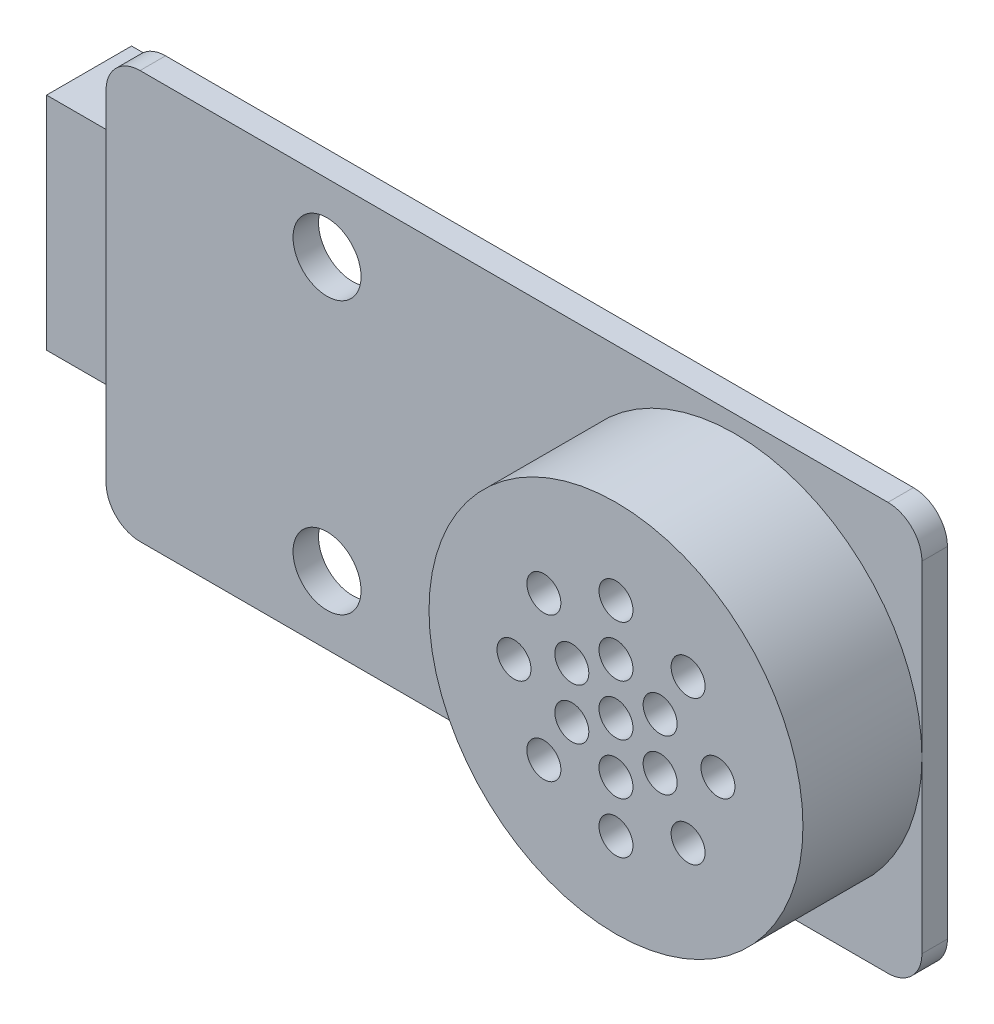
ISO-10303-21;
HEADER;
FILE_DESCRIPTION(('STEP AP214'),'2;1');
FILE_NAME('part.step','',(''),(''),'','','');
FILE_SCHEMA(('AUTOMOTIVE_DESIGN { 1 0 10303 214 1 1 1 1 }'));
ENDSEC;
DATA;
#1=APPLICATION_CONTEXT('core data for automotive mechanical design processes');
#2=APPLICATION_PROTOCOL_DEFINITION('international standard','automotive_design',2000,#1);
#3=PRODUCT_CONTEXT('',#1,'mechanical');
#4=PRODUCT('Part','Part','',(#3));
#5=PRODUCT_RELATED_PRODUCT_CATEGORY('part','',(#4));
#6=PRODUCT_DEFINITION_FORMATION('','',#4);
#7=PRODUCT_DEFINITION_CONTEXT('part definition',#1,'design');
#8=PRODUCT_DEFINITION('design','',#6,#7);
#9=PRODUCT_DEFINITION_SHAPE('','',#8);
#10=(LENGTH_UNIT() NAMED_UNIT(*) SI_UNIT(.MILLI.,.METRE.));
#11=(NAMED_UNIT(*) PLANE_ANGLE_UNIT() SI_UNIT($,.RADIAN.));
#12=(NAMED_UNIT(*) SI_UNIT($,.STERADIAN.) SOLID_ANGLE_UNIT());
#13=UNCERTAINTY_MEASURE_WITH_UNIT(LENGTH_MEASURE(1.E-05),#10,'distance_accuracy_value','');
#14=(GEOMETRIC_REPRESENTATION_CONTEXT(3) GLOBAL_UNCERTAINTY_ASSIGNED_CONTEXT((#13)) GLOBAL_UNIT_ASSIGNED_CONTEXT((#10,
#11,#12)) REPRESENTATION_CONTEXT('',''));
#15=CARTESIAN_POINT('',(0.,0.,0.));
#16=DIRECTION('',(0.,0.,1.));
#17=DIRECTION('',(1.,0.,0.));
#18=AXIS2_PLACEMENT_3D('',#15,#16,#17);
#19=CARTESIAN_POINT('',(24.,-12.,1.5));
#20=DIRECTION('',(-1.,0.,0.));
#21=DIRECTION('',(0.,0.,1.));
#22=AXIS2_PLACEMENT_3D('',#19,#20,#21);
#23=PLANE('',#22);
#24=DIRECTION('',(0.,1.,0.));
#25=VECTOR('',#24,1.);
#26=CARTESIAN_POINT('',(24.,-12.,1.5));
#27=LINE('',#26,#25);
#28=CARTESIAN_POINT('',(24.,-10.,1.5));
#29=VERTEX_POINT('',#28);
#30=CARTESIAN_POINT('',(24.,0.,1.5));
#31=VERTEX_POINT('',#30);
#32=EDGE_CURVE('E179',#29,#31,#27,.T.);
#33=ORIENTED_EDGE('',*,*,#32,.F.);
#34=DIRECTION('',(0.,0.,-1.));
#35=VECTOR('',#34,1.);
#36=CARTESIAN_POINT('',(24.,-10.,1.5));
#37=LINE('',#36,#35);
#38=CARTESIAN_POINT('',(24.,-10.,0.));
#39=VERTEX_POINT('',#38);
#40=EDGE_CURVE('E232',#29,#39,#37,.T.);
#41=ORIENTED_EDGE('',*,*,#40,.T.);
#42=DIRECTION('',(0.,1.,0.));
#43=VECTOR('',#42,1.);
#44=CARTESIAN_POINT('',(24.,-12.,0.));
#45=LINE('',#44,#43);
#46=CARTESIAN_POINT('',(24.,10.,0.));
#47=VERTEX_POINT('',#46);
#48=EDGE_CURVE('E177',#39,#47,#45,.T.);
#49=ORIENTED_EDGE('',*,*,#48,.T.);
#50=DIRECTION('',(0.,0.,-1.));
#51=VECTOR('',#50,1.);
#52=CARTESIAN_POINT('',(24.,10.,1.5));
#53=LINE('',#52,#51);
#54=CARTESIAN_POINT('',(24.,10.,1.5));
#55=VERTEX_POINT('',#54);
#56=EDGE_CURVE('E229',#47,#55,#53,.F.);
#57=ORIENTED_EDGE('',*,*,#56,.T.);
#58=EDGE_CURVE('E182',#31,#55,#27,.T.);
#59=ORIENTED_EDGE('',*,*,#58,.F.);
#60=EDGE_LOOP('',(#33,#41,#49,#57,#59));
#61=FACE_BOUND('',#60,.T.);
#62=ADVANCED_FACE('F42',(#61),#23,.F.);
#63=CARTESIAN_POINT('',(-24.,12.,1.5));
#64=DIRECTION('',(0.,-1.,0.));
#65=DIRECTION('',(0.,0.,-1.));
#66=AXIS2_PLACEMENT_3D('',#63,#64,#65);
#67=PLANE('',#66);
#68=DIRECTION('',(-1.,0.,0.));
#69=VECTOR('',#68,1.);
#70=CARTESIAN_POINT('',(-24.,12.,1.5));
#71=LINE('',#70,#69);
#72=CARTESIAN_POINT('',(22.,12.,1.5));
#73=VERTEX_POINT('',#72);
#74=CARTESIAN_POINT('',(-22.,12.,1.5));
#75=VERTEX_POINT('',#74);
#76=EDGE_CURVE('E181',#73,#75,#71,.T.);
#77=ORIENTED_EDGE('',*,*,#76,.F.);
#78=DIRECTION('',(0.,0.,-1.));
#79=VECTOR('',#78,1.);
#80=CARTESIAN_POINT('',(22.,12.,1.5));
#81=LINE('',#80,#79);
#82=CARTESIAN_POINT('',(22.,12.,0.));
#83=VERTEX_POINT('',#82);
#84=EDGE_CURVE('E51',#73,#83,#81,.T.);
#85=ORIENTED_EDGE('',*,*,#84,.T.);
#86=DIRECTION('',(-1.,0.,0.));
#87=VECTOR('',#86,1.);
#88=CARTESIAN_POINT('',(-24.,12.,0.));
#89=LINE('',#88,#87);
#90=CARTESIAN_POINT('',(-22.,12.,0.));
#91=VERTEX_POINT('',#90);
#92=EDGE_CURVE('E194',#83,#91,#89,.T.);
#93=ORIENTED_EDGE('',*,*,#92,.T.);
#94=DIRECTION('',(0.,0.,-1.));
#95=VECTOR('',#94,1.);
#96=CARTESIAN_POINT('',(-22.,12.,1.5));
#97=LINE('',#96,#95);
#98=EDGE_CURVE('E235',#91,#75,#97,.F.);
#99=ORIENTED_EDGE('',*,*,#98,.T.);
#100=EDGE_LOOP('',(#77,#85,#93,#99));
#101=FACE_BOUND('',#100,.T.);
#102=ADVANCED_FACE('F318',(#101),#67,.F.);
#103=CARTESIAN_POINT('',(-24.,-12.,1.5));
#104=DIRECTION('',(1.,0.,0.));
#105=DIRECTION('',(0.,0.,-1.));
#106=AXIS2_PLACEMENT_3D('',#103,#104,#105);
#107=PLANE('',#106);
#108=DIRECTION('',(0.,-1.,0.));
#109=VECTOR('',#108,1.);
#110=CARTESIAN_POINT('',(-24.,-12.,0.));
#111=LINE('',#110,#109);
#112=CARTESIAN_POINT('',(-24.,10.,0.));
#113=VERTEX_POINT('',#112);
#114=CARTESIAN_POINT('',(-24.,6.5,0.));
#115=VERTEX_POINT('',#114);
#116=EDGE_CURVE('E197',#113,#115,#111,.T.);
#117=ORIENTED_EDGE('',*,*,#116,.T.);
#118=CARTESIAN_POINT('',(-24.,-6.5,0.));
#119=VERTEX_POINT('',#118);
#120=EDGE_CURVE('E201',#115,#119,#111,.T.);
#121=ORIENTED_EDGE('',*,*,#120,.T.);
#122=CARTESIAN_POINT('',(-24.,-10.,0.));
#123=VERTEX_POINT('',#122);
#124=EDGE_CURVE('E65',#119,#123,#111,.T.);
#125=ORIENTED_EDGE('',*,*,#124,.T.);
#126=DIRECTION('',(0.,0.,-1.));
#127=VECTOR('',#126,1.);
#128=CARTESIAN_POINT('',(-24.,-10.,1.5));
#129=LINE('',#128,#127);
#130=CARTESIAN_POINT('',(-24.,-10.,1.5));
#131=VERTEX_POINT('',#130);
#132=EDGE_CURVE('E219',#123,#131,#129,.F.);
#133=ORIENTED_EDGE('',*,*,#132,.T.);
#134=DIRECTION('',(0.,-1.,0.));
#135=VECTOR('',#134,1.);
#136=CARTESIAN_POINT('',(-24.,-12.,1.5));
#137=LINE('',#136,#135);
#138=CARTESIAN_POINT('',(-24.,10.,1.5));
#139=VERTEX_POINT('',#138);
#140=EDGE_CURVE('E185',#139,#131,#137,.T.);
#141=ORIENTED_EDGE('',*,*,#140,.F.);
#142=DIRECTION('',(0.,0.,-1.));
#143=VECTOR('',#142,1.);
#144=CARTESIAN_POINT('',(-24.,10.,1.5));
#145=LINE('',#144,#143);
#146=EDGE_CURVE('E216',#139,#113,#145,.T.);
#147=ORIENTED_EDGE('',*,*,#146,.T.);
#148=EDGE_LOOP('',(#117,#121,#125,#133,#141,#147));
#149=FACE_BOUND('',#148,.T.);
#150=ADVANCED_FACE('F276',(#149),#107,.F.);
#151=CARTESIAN_POINT('',(-24.,-12.,1.5));
#152=DIRECTION('',(0.,1.,0.));
#153=DIRECTION('',(0.,0.,1.));
#154=AXIS2_PLACEMENT_3D('',#151,#152,#153);
#155=PLANE('',#154);
#156=DIRECTION('',(1.,0.,0.));
#157=VECTOR('',#156,1.);
#158=CARTESIAN_POINT('',(-24.,-12.,1.5));
#159=LINE('',#158,#157);
#160=CARTESIAN_POINT('',(-22.,-12.,1.5));
#161=VERTEX_POINT('',#160);
#162=CARTESIAN_POINT('',(22.,-12.,1.5));
#163=VERTEX_POINT('',#162);
#164=EDGE_CURVE('E188',#161,#163,#159,.T.);
#165=ORIENTED_EDGE('',*,*,#164,.F.);
#166=DIRECTION('',(0.,0.,-1.));
#167=VECTOR('',#166,1.);
#168=CARTESIAN_POINT('',(-22.,-12.,1.5));
#169=LINE('',#168,#167);
#170=CARTESIAN_POINT('',(-22.,-12.,0.));
#171=VERTEX_POINT('',#170);
#172=EDGE_CURVE('E205',#161,#171,#169,.T.);
#173=ORIENTED_EDGE('',*,*,#172,.T.);
#174=DIRECTION('',(1.,0.,0.));
#175=VECTOR('',#174,1.);
#176=CARTESIAN_POINT('',(-24.,-12.,0.));
#177=LINE('',#176,#175);
#178=CARTESIAN_POINT('',(22.,-12.,0.));
#179=VERTEX_POINT('',#178);
#180=EDGE_CURVE('E200',#171,#179,#177,.T.);
#181=ORIENTED_EDGE('',*,*,#180,.T.);
#182=DIRECTION('',(0.,0.,-1.));
#183=VECTOR('',#182,1.);
#184=CARTESIAN_POINT('',(22.,-12.,1.5));
#185=LINE('',#184,#183);
#186=EDGE_CURVE('E191',#179,#163,#185,.F.);
#187=ORIENTED_EDGE('',*,*,#186,.T.);
#188=EDGE_LOOP('',(#165,#173,#181,#187));
#189=FACE_BOUND('',#188,.T.);
#190=ADVANCED_FACE('F289',(#189),#155,.F.);
#191=CARTESIAN_POINT('',(0.,0.,1.5));
#192=DIRECTION('',(0.,0.,-1.));
#193=DIRECTION('',(-1.,0.,0.));
#194=AXIS2_PLACEMENT_3D('',#191,#192,#193);
#195=PLANE('',#194);
#196=CARTESIAN_POINT('',(-11.,8.,1.5));
#197=DIRECTION('',(0.,0.,1.));
#198=DIRECTION('',(1.,0.,0.));
#199=AXIS2_PLACEMENT_3D('',#196,#197,#198);
#200=CIRCLE('',#199,2.);
#201=CARTESIAN_POINT('',(-9.,8.,1.5));
#202=VERTEX_POINT('',#201);
#203=EDGE_CURVE('E240',#202,#202,#200,.T.);
#204=ORIENTED_EDGE('',*,*,#203,.F.);
#205=EDGE_LOOP('',(#204));
#206=FACE_BOUND('',#205,.T.);
#207=CARTESIAN_POINT('',(-11.,-8.,1.5));
#208=DIRECTION('',(0.,0.,1.));
#209=DIRECTION('',(-1.,0.,0.));
#210=AXIS2_PLACEMENT_3D('',#207,#208,#209);
#211=CIRCLE('',#210,2.);
#212=CARTESIAN_POINT('',(-13.,-8.,1.5));
#213=VERTEX_POINT('',#212);
#214=EDGE_CURVE('E245',#213,#213,#211,.T.);
#215=ORIENTED_EDGE('',*,*,#214,.F.);
#216=EDGE_LOOP('',(#215));
#217=FACE_BOUND('',#216,.T.);
#218=ORIENTED_EDGE('',*,*,#32,.T.);
#219=CARTESIAN_POINT('',(13.,0.,1.5));
#220=DIRECTION('',(0.,0.,1.));
#221=DIRECTION('',(1.,0.,0.));
#222=AXIS2_PLACEMENT_3D('',#219,#220,#221);
#223=CIRCLE('',#222,11.);
#224=EDGE_CURVE('E167',#31,#31,#223,.T.);
#225=ORIENTED_EDGE('',*,*,#224,.F.);
#226=ORIENTED_EDGE('',*,*,#58,.T.);
#227=CARTESIAN_POINT('',(22.,10.,1.5));
#228=DIRECTION('',(0.,0.,-1.));
#229=DIRECTION('',(-1.,0.,0.));
#230=AXIS2_PLACEMENT_3D('',#227,#228,#229);
#231=CIRCLE('',#230,2.);
#232=EDGE_CURVE('E223',#55,#73,#231,.F.);
#233=ORIENTED_EDGE('',*,*,#232,.T.);
#234=ORIENTED_EDGE('',*,*,#76,.T.);
#235=CARTESIAN_POINT('',(-22.,10.,1.5));
#236=DIRECTION('',(0.,0.,-1.));
#237=DIRECTION('',(-1.,0.,0.));
#238=AXIS2_PLACEMENT_3D('',#235,#236,#237);
#239=CIRCLE('',#238,2.);
#240=EDGE_CURVE('E221',#75,#139,#239,.F.);
#241=ORIENTED_EDGE('',*,*,#240,.T.);
#242=ORIENTED_EDGE('',*,*,#140,.T.);
#243=CARTESIAN_POINT('',(-22.,-10.,1.5));
#244=DIRECTION('',(0.,0.,-1.));
#245=DIRECTION('',(-1.,0.,0.));
#246=AXIS2_PLACEMENT_3D('',#243,#244,#245);
#247=CIRCLE('',#246,2.);
#248=EDGE_CURVE('E227',#131,#161,#247,.F.);
#249=ORIENTED_EDGE('',*,*,#248,.T.);
#250=ORIENTED_EDGE('',*,*,#164,.T.);
#251=CARTESIAN_POINT('',(22.,-10.,1.5));
#252=DIRECTION('',(0.,0.,-1.));
#253=DIRECTION('',(-1.,0.,0.));
#254=AXIS2_PLACEMENT_3D('',#251,#252,#253);
#255=CIRCLE('',#254,2.);
#256=EDGE_CURVE('E225',#163,#29,#255,.F.);
#257=ORIENTED_EDGE('',*,*,#256,.T.);
#258=EDGE_LOOP('',(#218,#225,#226,#233,#234,#241,#242,#249,#250,#257));
#259=FACE_BOUND('',#258,.T.);
#260=ADVANCED_FACE('F286',(#206,#217,#259),#195,.F.);
#261=CARTESIAN_POINT('',(0.,0.,0.));
#262=DIRECTION('',(0.,0.,-1.));
#263=DIRECTION('',(-1.,0.,0.));
#264=AXIS2_PLACEMENT_3D('',#261,#262,#263);
#265=PLANE('',#264);
#266=CARTESIAN_POINT('',(-11.,8.,0.));
#267=DIRECTION('',(0.,0.,-1.));
#268=DIRECTION('',(-1.,0.,0.));
#269=AXIS2_PLACEMENT_3D('',#266,#267,#268);
#270=CIRCLE('',#269,2.);
#271=CARTESIAN_POINT('',(-13.,8.,0.));
#272=VERTEX_POINT('',#271);
#273=EDGE_CURVE('E46',#272,#272,#270,.T.);
#274=ORIENTED_EDGE('',*,*,#273,.F.);
#275=EDGE_LOOP('',(#274));
#276=FACE_BOUND('',#275,.T.);
#277=CARTESIAN_POINT('',(-11.,-8.,0.));
#278=DIRECTION('',(0.,0.,-1.));
#279=DIRECTION('',(-1.,0.,0.));
#280=AXIS2_PLACEMENT_3D('',#277,#278,#279);
#281=CIRCLE('',#280,2.);
#282=CARTESIAN_POINT('',(-13.,-8.,0.));
#283=VERTEX_POINT('',#282);
#284=EDGE_CURVE('E238',#283,#283,#281,.T.);
#285=ORIENTED_EDGE('',*,*,#284,.F.);
#286=EDGE_LOOP('',(#285));
#287=FACE_BOUND('',#286,.T.);
#288=DIRECTION('',(-1.,0.,0.));
#289=VECTOR('',#288,1.);
#290=CARTESIAN_POINT('',(-18.,-6.5,0.));
#291=LINE('',#290,#289);
#292=CARTESIAN_POINT('',(-18.,-6.5,0.));
#293=VERTEX_POINT('',#292);
#294=EDGE_CURVE('E60',#293,#119,#291,.T.);
#295=ORIENTED_EDGE('',*,*,#294,.F.);
#296=DIRECTION('',(0.,-1.,0.));
#297=VECTOR('',#296,1.);
#298=CARTESIAN_POINT('',(-18.,-6.5,0.));
#299=LINE('',#298,#297);
#300=CARTESIAN_POINT('',(-18.,6.5,0.));
#301=VERTEX_POINT('',#300);
#302=EDGE_CURVE('E259',#301,#293,#299,.T.);
#303=ORIENTED_EDGE('',*,*,#302,.F.);
#304=DIRECTION('',(1.,0.,0.));
#305=VECTOR('',#304,1.);
#306=CARTESIAN_POINT('',(-18.,6.5,0.));
#307=LINE('',#306,#305);
#308=EDGE_CURVE('E11',#115,#301,#307,.T.);
#309=ORIENTED_EDGE('',*,*,#308,.F.);
#310=ORIENTED_EDGE('',*,*,#116,.F.);
#311=CARTESIAN_POINT('',(-22.,10.,0.));
#312=DIRECTION('',(0.,0.,-1.));
#313=DIRECTION('',(-1.,0.,0.));
#314=AXIS2_PLACEMENT_3D('',#311,#312,#313);
#315=CIRCLE('',#314,2.);
#316=EDGE_CURVE('E208',#113,#91,#315,.T.);
#317=ORIENTED_EDGE('',*,*,#316,.T.);
#318=ORIENTED_EDGE('',*,*,#92,.F.);
#319=CARTESIAN_POINT('',(22.,10.,0.));
#320=DIRECTION('',(0.,0.,-1.));
#321=DIRECTION('',(-1.,0.,0.));
#322=AXIS2_PLACEMENT_3D('',#319,#320,#321);
#323=CIRCLE('',#322,2.);
#324=EDGE_CURVE('E210',#83,#47,#323,.T.);
#325=ORIENTED_EDGE('',*,*,#324,.T.);
#326=ORIENTED_EDGE('',*,*,#48,.F.);
#327=CARTESIAN_POINT('',(22.,-10.,0.));
#328=DIRECTION('',(0.,0.,-1.));
#329=DIRECTION('',(-1.,0.,0.));
#330=AXIS2_PLACEMENT_3D('',#327,#328,#329);
#331=CIRCLE('',#330,2.);
#332=EDGE_CURVE('E212',#39,#179,#331,.T.);
#333=ORIENTED_EDGE('',*,*,#332,.T.);
#334=ORIENTED_EDGE('',*,*,#180,.F.);
#335=CARTESIAN_POINT('',(-22.,-10.,0.));
#336=DIRECTION('',(0.,0.,-1.));
#337=DIRECTION('',(-1.,0.,0.));
#338=AXIS2_PLACEMENT_3D('',#335,#336,#337);
#339=CIRCLE('',#338,2.);
#340=EDGE_CURVE('E214',#171,#123,#339,.T.);
#341=ORIENTED_EDGE('',*,*,#340,.T.);
#342=ORIENTED_EDGE('',*,*,#124,.F.);
#343=EDGE_LOOP('',(#295,#303,#309,#310,#317,#318,#325,#326,#333,#334,#341,#342));
#344=FACE_BOUND('',#343,.T.);
#345=ADVANCED_FACE('F269',(#276,#287,#344),#265,.T.);
#346=CARTESIAN_POINT('',(-22.,-10.,1.5));
#347=DIRECTION('',(0.,0.,-1.));
#348=DIRECTION('',(-1.,0.,0.));
#349=AXIS2_PLACEMENT_3D('',#346,#347,#348);
#350=CYLINDRICAL_SURFACE('',#349,2.);
#351=ORIENTED_EDGE('',*,*,#248,.F.);
#352=ORIENTED_EDGE('',*,*,#132,.F.);
#353=ORIENTED_EDGE('',*,*,#340,.F.);
#354=ORIENTED_EDGE('',*,*,#172,.F.);
#355=EDGE_LOOP('',(#351,#352,#353,#354));
#356=FACE_BOUND('',#355,.T.);
#357=ADVANCED_FACE('F283',(#356),#350,.T.);
#358=CARTESIAN_POINT('',(22.,-10.,1.5));
#359=DIRECTION('',(0.,0.,-1.));
#360=DIRECTION('',(-1.,0.,0.));
#361=AXIS2_PLACEMENT_3D('',#358,#359,#360);
#362=CYLINDRICAL_SURFACE('',#361,2.);
#363=ORIENTED_EDGE('',*,*,#256,.F.);
#364=ORIENTED_EDGE('',*,*,#186,.F.);
#365=ORIENTED_EDGE('',*,*,#332,.F.);
#366=ORIENTED_EDGE('',*,*,#40,.F.);
#367=EDGE_LOOP('',(#363,#364,#365,#366));
#368=FACE_BOUND('',#367,.T.);
#369=ADVANCED_FACE('F292',(#368),#362,.T.);
#370=CARTESIAN_POINT('',(22.,10.,1.5));
#371=DIRECTION('',(0.,0.,-1.));
#372=DIRECTION('',(-1.,0.,0.));
#373=AXIS2_PLACEMENT_3D('',#370,#371,#372);
#374=CYLINDRICAL_SURFACE('',#373,2.);
#375=ORIENTED_EDGE('',*,*,#232,.F.);
#376=ORIENTED_EDGE('',*,*,#56,.F.);
#377=ORIENTED_EDGE('',*,*,#324,.F.);
#378=ORIENTED_EDGE('',*,*,#84,.F.);
#379=EDGE_LOOP('',(#375,#376,#377,#378));
#380=FACE_BOUND('',#379,.T.);
#381=ADVANCED_FACE('F313',(#380),#374,.T.);
#382=CARTESIAN_POINT('',(-22.,10.,1.5));
#383=DIRECTION('',(0.,0.,-1.));
#384=DIRECTION('',(-1.,0.,0.));
#385=AXIS2_PLACEMENT_3D('',#382,#383,#384);
#386=CYLINDRICAL_SURFACE('',#385,2.);
#387=ORIENTED_EDGE('',*,*,#240,.F.);
#388=ORIENTED_EDGE('',*,*,#98,.F.);
#389=ORIENTED_EDGE('',*,*,#316,.F.);
#390=ORIENTED_EDGE('',*,*,#146,.F.);
#391=EDGE_LOOP('',(#387,#388,#389,#390));
#392=FACE_BOUND('',#391,.T.);
#393=ADVANCED_FACE('F44',(#392),#386,.T.);
#394=CARTESIAN_POINT('',(13.,0.,8.5));
#395=DIRECTION('',(0.,0.,-1.));
#396=DIRECTION('',(-1.,0.,0.));
#397=AXIS2_PLACEMENT_3D('',#394,#395,#396);
#398=CYLINDRICAL_SURFACE('',#397,11.);
#399=CARTESIAN_POINT('',(13.,0.,8.5));
#400=DIRECTION('',(0.,0.,1.));
#401=DIRECTION('',(1.,0.,0.));
#402=AXIS2_PLACEMENT_3D('',#399,#400,#401);
#403=CIRCLE('',#402,11.);
#404=CARTESIAN_POINT('',(24.,0.,8.5));
#405=VERTEX_POINT('',#404);
#406=EDGE_CURVE('E170',#405,#405,#403,.T.);
#407=ORIENTED_EDGE('',*,*,#406,.F.);
#408=EDGE_LOOP('',(#407));
#409=FACE_BOUND('',#408,.T.);
#410=ORIENTED_EDGE('',*,*,#224,.T.);
#411=EDGE_LOOP('',(#410));
#412=FACE_BOUND('',#411,.T.);
#413=ADVANCED_FACE('F302',(#409,#412),#398,.T.);
#414=CARTESIAN_POINT('',(13.,0.,8.5));
#415=DIRECTION('',(0.,0.,1.));
#416=DIRECTION('',(1.,0.,0.));
#417=AXIS2_PLACEMENT_3D('',#414,#415,#416);
#418=PLANE('',#417);
#419=CARTESIAN_POINT('',(8.75735931288071,4.24264068711929,8.5));
#420=DIRECTION('',(0.,0.,1.));
#421=DIRECTION('',(1.,0.,0.));
#422=AXIS2_PLACEMENT_3D('',#419,#420,#421);
#423=CIRCLE('',#422,1.);
#424=CARTESIAN_POINT('',(9.75735931288071,4.24264068711929,8.5));
#425=VERTEX_POINT('',#424);
#426=EDGE_CURVE('E884',#425,#425,#423,.T.);
#427=ORIENTED_EDGE('',*,*,#426,.F.);
#428=EDGE_LOOP('',(#427));
#429=FACE_BOUND('',#428,.T.);
#430=CARTESIAN_POINT('',(10.4019237886467,1.5,8.5));
#431=DIRECTION('',(0.,0.,1.));
#432=DIRECTION('',(1.,0.,0.));
#433=AXIS2_PLACEMENT_3D('',#430,#431,#432);
#434=CIRCLE('',#433,1.);
#435=CARTESIAN_POINT('',(11.4019237886467,1.5,8.5));
#436=VERTEX_POINT('',#435);
#437=EDGE_CURVE('E896',#436,#436,#434,.T.);
#438=ORIENTED_EDGE('',*,*,#437,.F.);
#439=EDGE_LOOP('',(#438));
#440=FACE_BOUND('',#439,.T.);
#441=CARTESIAN_POINT('',(10.4019237886467,-1.5,8.5));
#442=DIRECTION('',(0.,0.,1.));
#443=DIRECTION('',(1.,0.,0.));
#444=AXIS2_PLACEMENT_3D('',#441,#442,#443);
#445=CIRCLE('',#444,1.);
#446=CARTESIAN_POINT('',(11.4019237886467,-1.5,8.5));
#447=VERTEX_POINT('',#446);
#448=EDGE_CURVE('E984',#447,#447,#445,.T.);
#449=ORIENTED_EDGE('',*,*,#448,.F.);
#450=EDGE_LOOP('',(#449));
#451=FACE_BOUND('',#450,.T.);
#452=CARTESIAN_POINT('',(13.,-3.,8.5));
#453=DIRECTION('',(0.,0.,1.));
#454=DIRECTION('',(1.,0.,0.));
#455=AXIS2_PLACEMENT_3D('',#452,#453,#454);
#456=CIRCLE('',#455,1.);
#457=CARTESIAN_POINT('',(14.,-3.,8.5));
#458=VERTEX_POINT('',#457);
#459=EDGE_CURVE('E922',#458,#458,#456,.T.);
#460=ORIENTED_EDGE('',*,*,#459,.F.);
#461=EDGE_LOOP('',(#460));
#462=FACE_BOUND('',#461,.T.);
#463=CARTESIAN_POINT('',(15.5980762113533,-1.5,8.5));
#464=DIRECTION('',(0.,0.,1.));
#465=DIRECTION('',(1.,0.,0.));
#466=AXIS2_PLACEMENT_3D('',#463,#464,#465);
#467=CIRCLE('',#466,1.);
#468=CARTESIAN_POINT('',(16.5980762113533,-1.5,8.5));
#469=VERTEX_POINT('',#468);
#470=EDGE_CURVE('E916',#469,#469,#467,.T.);
#471=ORIENTED_EDGE('',*,*,#470,.F.);
#472=EDGE_LOOP('',(#471));
#473=FACE_BOUND('',#472,.T.);
#474=CARTESIAN_POINT('',(15.5980762113533,1.5,8.5));
#475=DIRECTION('',(0.,0.,1.));
#476=DIRECTION('',(1.,0.,0.));
#477=AXIS2_PLACEMENT_3D('',#474,#475,#476);
#478=CIRCLE('',#477,1.);
#479=CARTESIAN_POINT('',(16.5980762113533,1.5,8.5));
#480=VERTEX_POINT('',#479);
#481=EDGE_CURVE('E910',#480,#480,#478,.T.);
#482=ORIENTED_EDGE('',*,*,#481,.F.);
#483=EDGE_LOOP('',(#482));
#484=FACE_BOUND('',#483,.T.);
#485=CARTESIAN_POINT('',(6.99999999999999,0.,8.5));
#486=DIRECTION('',(0.,0.,1.));
#487=DIRECTION('',(1.,0.,0.));
#488=AXIS2_PLACEMENT_3D('',#485,#486,#487);
#489=CIRCLE('',#488,1.);
#490=CARTESIAN_POINT('',(7.99999999999999,0.,8.5));
#491=VERTEX_POINT('',#490);
#492=EDGE_CURVE('E903',#491,#491,#489,.T.);
#493=ORIENTED_EDGE('',*,*,#492,.F.);
#494=EDGE_LOOP('',(#493));
#495=FACE_BOUND('',#494,.T.);
#496=CARTESIAN_POINT('',(13.,3.,8.5));
#497=DIRECTION('',(0.,0.,1.));
#498=DIRECTION('',(1.,0.,0.));
#499=AXIS2_PLACEMENT_3D('',#496,#497,#498);
#500=CIRCLE('',#499,1.);
#501=CARTESIAN_POINT('',(14.,3.,8.5));
#502=VERTEX_POINT('',#501);
#503=EDGE_CURVE('E902',#502,#502,#500,.T.);
#504=ORIENTED_EDGE('',*,*,#503,.F.);
#505=EDGE_LOOP('',(#504));
#506=FACE_BOUND('',#505,.T.);
#507=CARTESIAN_POINT('',(8.75735931288071,-4.24264068711929,8.5));
#508=DIRECTION('',(0.,0.,1.));
#509=DIRECTION('',(1.,0.,0.));
#510=AXIS2_PLACEMENT_3D('',#507,#508,#509);
#511=CIRCLE('',#510,1.);
#512=CARTESIAN_POINT('',(9.75735931288071,-4.24264068711929,8.5));
#513=VERTEX_POINT('',#512);
#514=EDGE_CURVE('E944',#513,#513,#511,.T.);
#515=ORIENTED_EDGE('',*,*,#514,.F.);
#516=EDGE_LOOP('',(#515));
#517=FACE_BOUND('',#516,.T.);
#518=CARTESIAN_POINT('',(13.,-6.,8.5));
#519=DIRECTION('',(0.,0.,1.));
#520=DIRECTION('',(1.,0.,0.));
#521=AXIS2_PLACEMENT_3D('',#518,#519,#520);
#522=CIRCLE('',#521,1.);
#523=CARTESIAN_POINT('',(14.,-6.,8.5));
#524=VERTEX_POINT('',#523);
#525=EDGE_CURVE('E948',#524,#524,#522,.T.);
#526=ORIENTED_EDGE('',*,*,#525,.F.);
#527=EDGE_LOOP('',(#526));
#528=FACE_BOUND('',#527,.T.);
#529=CARTESIAN_POINT('',(17.2426406871193,-4.24264068711929,8.5));
#530=DIRECTION('',(0.,0.,1.));
#531=DIRECTION('',(1.,0.,0.));
#532=AXIS2_PLACEMENT_3D('',#529,#530,#531);
#533=CIRCLE('',#532,1.);
#534=CARTESIAN_POINT('',(18.2426406871193,-4.24264068711929,8.5));
#535=VERTEX_POINT('',#534);
#536=EDGE_CURVE('E952',#535,#535,#533,.T.);
#537=ORIENTED_EDGE('',*,*,#536,.F.);
#538=EDGE_LOOP('',(#537));
#539=FACE_BOUND('',#538,.T.);
#540=CARTESIAN_POINT('',(19.,0.,8.5));
#541=DIRECTION('',(0.,0.,1.));
#542=DIRECTION('',(1.,0.,0.));
#543=AXIS2_PLACEMENT_3D('',#540,#541,#542);
#544=CIRCLE('',#543,1.);
#545=CARTESIAN_POINT('',(20.,0.,8.5));
#546=VERTEX_POINT('',#545);
#547=EDGE_CURVE('E956',#546,#546,#544,.T.);
#548=ORIENTED_EDGE('',*,*,#547,.F.);
#549=EDGE_LOOP('',(#548));
#550=FACE_BOUND('',#549,.T.);
#551=CARTESIAN_POINT('',(17.2426406871193,4.24264068711929,8.5));
#552=DIRECTION('',(0.,0.,1.));
#553=DIRECTION('',(1.,0.,0.));
#554=AXIS2_PLACEMENT_3D('',#551,#552,#553);
#555=CIRCLE('',#554,1.);
#556=CARTESIAN_POINT('',(18.2426406871193,4.24264068711929,8.5));
#557=VERTEX_POINT('',#556);
#558=EDGE_CURVE('E960',#557,#557,#555,.T.);
#559=ORIENTED_EDGE('',*,*,#558,.F.);
#560=EDGE_LOOP('',(#559));
#561=FACE_BOUND('',#560,.T.);
#562=CARTESIAN_POINT('',(13.,6.,8.5));
#563=DIRECTION('',(0.,0.,1.));
#564=DIRECTION('',(1.,0.,0.));
#565=AXIS2_PLACEMENT_3D('',#562,#563,#564);
#566=CIRCLE('',#565,1.);
#567=CARTESIAN_POINT('',(14.,6.,8.5));
#568=VERTEX_POINT('',#567);
#569=EDGE_CURVE('E888',#568,#568,#566,.T.);
#570=ORIENTED_EDGE('',*,*,#569,.F.);
#571=EDGE_LOOP('',(#570));
#572=FACE_BOUND('',#571,.T.);
#573=CARTESIAN_POINT('',(13.,0.,8.5));
#574=DIRECTION('',(0.,0.,1.));
#575=DIRECTION('',(1.,0.,0.));
#576=AXIS2_PLACEMENT_3D('',#573,#574,#575);
#577=CIRCLE('',#576,1.);
#578=CARTESIAN_POINT('',(14.,0.,8.5));
#579=VERTEX_POINT('',#578);
#580=EDGE_CURVE('E906',#579,#579,#577,.T.);
#581=ORIENTED_EDGE('',*,*,#580,.F.);
#582=EDGE_LOOP('',(#581));
#583=FACE_BOUND('',#582,.T.);
#584=ORIENTED_EDGE('',*,*,#406,.T.);
#585=EDGE_LOOP('',(#584));
#586=FACE_BOUND('',#585,.T.);
#587=ADVANCED_FACE('F304',(#429,#440,#451,#462,#473,#484,#495,#506,#517,#528,#539,#550,#561,
#572,#583,#586),#418,.T.);
#588=CARTESIAN_POINT('',(0.,0.,0.));
#589=DIRECTION('',(0.,0.,1.));
#590=DIRECTION('',(1.,0.,0.));
#591=AXIS2_PLACEMENT_3D('',#588,#589,#590);
#592=PLANE('',#591);
#593=ORIENTED_EDGE('',*,*,#120,.F.);
#594=CARTESIAN_POINT('',(-29.,6.5,0.));
#595=VERTEX_POINT('',#594);
#596=EDGE_CURVE('E53',#595,#115,#307,.T.);
#597=ORIENTED_EDGE('',*,*,#596,.F.);
#598=DIRECTION('',(0.,1.,0.));
#599=VECTOR('',#598,1.);
#600=CARTESIAN_POINT('',(-29.,-6.5,0.));
#601=LINE('',#600,#599);
#602=CARTESIAN_POINT('',(-29.,-6.5,0.));
#603=VERTEX_POINT('',#602);
#604=EDGE_CURVE('E166',#603,#595,#601,.T.);
#605=ORIENTED_EDGE('',*,*,#604,.F.);
#606=EDGE_CURVE('E261',#119,#603,#291,.T.);
#607=ORIENTED_EDGE('',*,*,#606,.F.);
#608=EDGE_LOOP('',(#593,#597,#605,#607));
#609=FACE_BOUND('',#608,.T.);
#610=ADVANCED_FACE('F273',(#609),#592,.T.);
#611=CARTESIAN_POINT('',(-29.,-6.5,-5.));
#612=DIRECTION('',(1.,0.,0.));
#613=DIRECTION('',(0.,0.,-1.));
#614=AXIS2_PLACEMENT_3D('',#611,#612,#613);
#615=PLANE('',#614);
#616=ORIENTED_EDGE('',*,*,#604,.T.);
#617=DIRECTION('',(0.,0.,1.));
#618=VECTOR('',#617,1.);
#619=CARTESIAN_POINT('',(-29.,6.5,-5.));
#620=LINE('',#619,#618);
#621=CARTESIAN_POINT('',(-29.,6.5,-5.));
#622=VERTEX_POINT('',#621);
#623=EDGE_CURVE('E147',#622,#595,#620,.T.);
#624=ORIENTED_EDGE('',*,*,#623,.F.);
#625=DIRECTION('',(0.,1.,0.));
#626=VECTOR('',#625,1.);
#627=CARTESIAN_POINT('',(-29.,-6.5,-5.));
#628=LINE('',#627,#626);
#629=CARTESIAN_POINT('',(-29.,-6.5,-5.));
#630=VERTEX_POINT('',#629);
#631=EDGE_CURVE('E154',#630,#622,#628,.T.);
#632=ORIENTED_EDGE('',*,*,#631,.F.);
#633=DIRECTION('',(0.,0.,1.));
#634=VECTOR('',#633,1.);
#635=CARTESIAN_POINT('',(-29.,-6.5,-5.));
#636=LINE('',#635,#634);
#637=EDGE_CURVE('E257',#630,#603,#636,.T.);
#638=ORIENTED_EDGE('',*,*,#637,.T.);
#639=EDGE_LOOP('',(#616,#624,#632,#638));
#640=FACE_BOUND('',#639,.T.);
#641=ADVANCED_FACE('F164',(#640),#615,.F.);
#642=CARTESIAN_POINT('',(-18.,6.5,-5.));
#643=DIRECTION('',(0.,-1.,0.));
#644=DIRECTION('',(0.,0.,-1.));
#645=AXIS2_PLACEMENT_3D('',#642,#643,#644);
#646=PLANE('',#645);
#647=ORIENTED_EDGE('',*,*,#596,.T.);
#648=ORIENTED_EDGE('',*,*,#308,.T.);
#649=DIRECTION('',(0.,0.,1.));
#650=VECTOR('',#649,1.);
#651=CARTESIAN_POINT('',(-18.,6.5,-5.));
#652=LINE('',#651,#650);
#653=CARTESIAN_POINT('',(-18.,6.5,-5.));
#654=VERTEX_POINT('',#653);
#655=EDGE_CURVE('E150',#654,#301,#652,.T.);
#656=ORIENTED_EDGE('',*,*,#655,.F.);
#657=DIRECTION('',(1.,0.,0.));
#658=VECTOR('',#657,1.);
#659=CARTESIAN_POINT('',(-18.,6.5,-5.));
#660=LINE('',#659,#658);
#661=EDGE_CURVE('E142',#622,#654,#660,.T.);
#662=ORIENTED_EDGE('',*,*,#661,.F.);
#663=ORIENTED_EDGE('',*,*,#623,.T.);
#664=EDGE_LOOP('',(#647,#648,#656,#662,#663));
#665=FACE_BOUND('',#664,.T.);
#666=ADVANCED_FACE('F145',(#665),#646,.F.);
#667=CARTESIAN_POINT('',(-18.,-6.5,-5.));
#668=DIRECTION('',(-1.,0.,0.));
#669=DIRECTION('',(0.,0.,1.));
#670=AXIS2_PLACEMENT_3D('',#667,#668,#669);
#671=PLANE('',#670);
#672=ORIENTED_EDGE('',*,*,#302,.T.);
#673=DIRECTION('',(0.,0.,1.));
#674=VECTOR('',#673,1.);
#675=CARTESIAN_POINT('',(-18.,-6.5,-5.));
#676=LINE('',#675,#674);
#677=CARTESIAN_POINT('',(-18.,-6.5,-5.));
#678=VERTEX_POINT('',#677);
#679=EDGE_CURVE('E172',#678,#293,#676,.T.);
#680=ORIENTED_EDGE('',*,*,#679,.F.);
#681=DIRECTION('',(0.,-1.,0.));
#682=VECTOR('',#681,1.);
#683=CARTESIAN_POINT('',(-18.,-6.5,-5.));
#684=LINE('',#683,#682);
#685=EDGE_CURVE('E153',#654,#678,#684,.T.);
#686=ORIENTED_EDGE('',*,*,#685,.F.);
#687=ORIENTED_EDGE('',*,*,#655,.T.);
#688=EDGE_LOOP('',(#672,#680,#686,#687));
#689=FACE_BOUND('',#688,.T.);
#690=ADVANCED_FACE('F268',(#689),#671,.F.);
#691=CARTESIAN_POINT('',(-18.,-6.5,-5.));
#692=DIRECTION('',(0.,1.,0.));
#693=DIRECTION('',(0.,0.,1.));
#694=AXIS2_PLACEMENT_3D('',#691,#692,#693);
#695=PLANE('',#694);
#696=ORIENTED_EDGE('',*,*,#294,.T.);
#697=ORIENTED_EDGE('',*,*,#606,.T.);
#698=ORIENTED_EDGE('',*,*,#637,.F.);
#699=DIRECTION('',(-1.,0.,0.));
#700=VECTOR('',#699,1.);
#701=CARTESIAN_POINT('',(-18.,-6.5,-5.));
#702=LINE('',#701,#700);
#703=EDGE_CURVE('E159',#678,#630,#702,.T.);
#704=ORIENTED_EDGE('',*,*,#703,.F.);
#705=ORIENTED_EDGE('',*,*,#679,.T.);
#706=EDGE_LOOP('',(#696,#697,#698,#704,#705));
#707=FACE_BOUND('',#706,.T.);
#708=ADVANCED_FACE('F266',(#707),#695,.F.);
#709=CARTESIAN_POINT('',(0.,0.,-5.));
#710=DIRECTION('',(0.,0.,1.));
#711=DIRECTION('',(1.,0.,0.));
#712=AXIS2_PLACEMENT_3D('',#709,#710,#711);
#713=PLANE('',#712);
#714=ORIENTED_EDGE('',*,*,#631,.T.);
#715=ORIENTED_EDGE('',*,*,#661,.T.);
#716=ORIENTED_EDGE('',*,*,#685,.T.);
#717=ORIENTED_EDGE('',*,*,#703,.T.);
#718=EDGE_LOOP('',(#714,#715,#716,#717));
#719=FACE_BOUND('',#718,.T.);
#720=ADVANCED_FACE('F157',(#719),#713,.F.);
#721=CARTESIAN_POINT('',(-11.,-8.,-3.5));
#722=DIRECTION('',(0.,0.,1.));
#723=DIRECTION('',(1.,0.,0.));
#724=AXIS2_PLACEMENT_3D('',#721,#722,#723);
#725=CYLINDRICAL_SURFACE('',#724,2.);
#726=ORIENTED_EDGE('',*,*,#284,.T.);
#727=EDGE_LOOP('',(#726));
#728=FACE_BOUND('',#727,.T.);
#729=ORIENTED_EDGE('',*,*,#214,.T.);
#730=EDGE_LOOP('',(#729));
#731=FACE_BOUND('',#730,.T.);
#732=ADVANCED_FACE('F423',(#728,#731),#725,.F.);
#733=CARTESIAN_POINT('',(-11.,8.,-3.5));
#734=DIRECTION('',(0.,0.,1.));
#735=DIRECTION('',(1.,0.,0.));
#736=AXIS2_PLACEMENT_3D('',#733,#734,#735);
#737=CYLINDRICAL_SURFACE('',#736,2.);
#738=ORIENTED_EDGE('',*,*,#273,.T.);
#739=EDGE_LOOP('',(#738));
#740=FACE_BOUND('',#739,.T.);
#741=ORIENTED_EDGE('',*,*,#203,.T.);
#742=EDGE_LOOP('',(#741));
#743=FACE_BOUND('',#742,.T.);
#744=ADVANCED_FACE('F453',(#740,#743),#737,.F.);
#745=CARTESIAN_POINT('',(0.,0.,1.5));
#746=DIRECTION('',(0.,0.,-1.));
#747=DIRECTION('',(-1.,0.,0.));
#748=AXIS2_PLACEMENT_3D('',#745,#746,#747);
#749=PLANE('',#748);
#750=CARTESIAN_POINT('',(13.,0.,1.5));
#751=DIRECTION('',(0.,0.,-1.));
#752=DIRECTION('',(-1.,0.,0.));
#753=AXIS2_PLACEMENT_3D('',#750,#751,#752);
#754=CIRCLE('',#753,1.);
#755=CARTESIAN_POINT('',(12.,0.,1.5));
#756=VERTEX_POINT('',#755);
#757=EDGE_CURVE('E250',#756,#756,#754,.F.);
#758=ORIENTED_EDGE('',*,*,#757,.T.);
#759=EDGE_LOOP('',(#758));
#760=FACE_BOUND('',#759,.T.);
#761=ADVANCED_FACE('F463',(#760),#749,.F.);
#762=CARTESIAN_POINT('',(13.,0.,-1.3284271247462));
#763=DIRECTION('',(0.,0.,1.));
#764=DIRECTION('',(1.,0.,0.));
#765=AXIS2_PLACEMENT_3D('',#762,#763,#764);
#766=CYLINDRICAL_SURFACE('',#765,1.);
#767=ORIENTED_EDGE('',*,*,#580,.T.);
#768=EDGE_LOOP('',(#767));
#769=FACE_BOUND('',#768,.T.);
#770=ORIENTED_EDGE('',*,*,#757,.F.);
#771=EDGE_LOOP('',(#770));
#772=FACE_BOUND('',#771,.T.);
#773=ADVANCED_FACE('F480',(#769,#772),#766,.F.);
#774=CARTESIAN_POINT('',(0.,0.,1.5));
#775=DIRECTION('',(0.,0.,-1.));
#776=DIRECTION('',(-1.,0.,0.));
#777=AXIS2_PLACEMENT_3D('',#774,#775,#776);
#778=PLANE('',#777);
#779=CARTESIAN_POINT('',(13.,6.,1.5));
#780=DIRECTION('',(0.,0.,-1.));
#781=DIRECTION('',(-1.,0.,0.));
#782=AXIS2_PLACEMENT_3D('',#779,#780,#781);
#783=CIRCLE('',#782,1.);
#784=CARTESIAN_POINT('',(12.,6.,1.5));
#785=VERTEX_POINT('',#784);
#786=EDGE_CURVE('E893',#785,#785,#783,.F.);
#787=ORIENTED_EDGE('',*,*,#786,.T.);
#788=EDGE_LOOP('',(#787));
#789=FACE_BOUND('',#788,.T.);
#790=ADVANCED_FACE('F491',(#789),#778,.F.);
#791=CARTESIAN_POINT('',(13.,6.,-1.3284271247462));
#792=DIRECTION('',(0.,0.,1.));
#793=DIRECTION('',(1.,0.,0.));
#794=AXIS2_PLACEMENT_3D('',#791,#792,#793);
#795=CYLINDRICAL_SURFACE('',#794,1.);
#796=ORIENTED_EDGE('',*,*,#569,.T.);
#797=EDGE_LOOP('',(#796));
#798=FACE_BOUND('',#797,.T.);
#799=ORIENTED_EDGE('',*,*,#786,.F.);
#800=EDGE_LOOP('',(#799));
#801=FACE_BOUND('',#800,.T.);
#802=ADVANCED_FACE('F502',(#798,#801),#795,.F.);
#803=CARTESIAN_POINT('',(0.,0.,1.5));
#804=DIRECTION('',(0.,0.,-1.));
#805=DIRECTION('',(-1.,0.,0.));
#806=AXIS2_PLACEMENT_3D('',#803,#804,#805);
#807=PLANE('',#806);
#808=CARTESIAN_POINT('',(17.2426406871193,4.24264068711929,1.5));
#809=DIRECTION('',(0.,0.,-1.));
#810=DIRECTION('',(-1.,0.,0.));
#811=AXIS2_PLACEMENT_3D('',#808,#809,#810);
#812=CIRCLE('',#811,1.);
#813=CARTESIAN_POINT('',(16.2426406871193,4.24264068711929,1.5));
#814=VERTEX_POINT('',#813);
#815=EDGE_CURVE('E966',#814,#814,#812,.F.);
#816=ORIENTED_EDGE('',*,*,#815,.T.);
#817=EDGE_LOOP('',(#816));
#818=FACE_BOUND('',#817,.T.);
#819=ADVANCED_FACE('F513',(#818),#807,.F.);
#820=CARTESIAN_POINT('',(17.2426406871193,4.24264068711929,-1.3284271247462));
#821=DIRECTION('',(0.,0.,1.));
#822=DIRECTION('',(1.,0.,0.));
#823=AXIS2_PLACEMENT_3D('',#820,#821,#822);
#824=CYLINDRICAL_SURFACE('',#823,1.);
#825=ORIENTED_EDGE('',*,*,#558,.T.);
#826=EDGE_LOOP('',(#825));
#827=FACE_BOUND('',#826,.T.);
#828=ORIENTED_EDGE('',*,*,#815,.F.);
#829=EDGE_LOOP('',(#828));
#830=FACE_BOUND('',#829,.T.);
#831=ADVANCED_FACE('F524',(#827,#830),#824,.F.);
#832=CARTESIAN_POINT('',(0.,0.,1.5));
#833=DIRECTION('',(0.,0.,-1.));
#834=DIRECTION('',(-1.,0.,0.));
#835=AXIS2_PLACEMENT_3D('',#832,#833,#834);
#836=PLANE('',#835);
#837=CARTESIAN_POINT('',(19.,0.,1.5));
#838=DIRECTION('',(0.,0.,-1.));
#839=DIRECTION('',(-1.,0.,0.));
#840=AXIS2_PLACEMENT_3D('',#837,#838,#839);
#841=CIRCLE('',#840,1.);
#842=CARTESIAN_POINT('',(18.,0.,1.5));
#843=VERTEX_POINT('',#842);
#844=EDGE_CURVE('E973',#843,#843,#841,.F.);
#845=ORIENTED_EDGE('',*,*,#844,.T.);
#846=EDGE_LOOP('',(#845));
#847=FACE_BOUND('',#846,.T.);
#848=ADVANCED_FACE('F535',(#847),#836,.F.);
#849=CARTESIAN_POINT('',(19.,0.,-1.3284271247462));
#850=DIRECTION('',(0.,0.,1.));
#851=DIRECTION('',(1.,0.,0.));
#852=AXIS2_PLACEMENT_3D('',#849,#850,#851);
#853=CYLINDRICAL_SURFACE('',#852,1.);
#854=ORIENTED_EDGE('',*,*,#547,.T.);
#855=EDGE_LOOP('',(#854));
#856=FACE_BOUND('',#855,.T.);
#857=ORIENTED_EDGE('',*,*,#844,.F.);
#858=EDGE_LOOP('',(#857));
#859=FACE_BOUND('',#858,.T.);
#860=ADVANCED_FACE('F546',(#856,#859),#853,.F.);
#861=CARTESIAN_POINT('',(0.,0.,1.5));
#862=DIRECTION('',(0.,0.,-1.));
#863=DIRECTION('',(-1.,0.,0.));
#864=AXIS2_PLACEMENT_3D('',#861,#862,#863);
#865=PLANE('',#864);
#866=CARTESIAN_POINT('',(17.2426406871193,-4.24264068711929,1.5));
#867=DIRECTION('',(0.,0.,-1.));
#868=DIRECTION('',(-1.,0.,0.));
#869=AXIS2_PLACEMENT_3D('',#866,#867,#868);
#870=CIRCLE('',#869,1.);
#871=CARTESIAN_POINT('',(16.2426406871193,-4.24264068711929,1.5));
#872=VERTEX_POINT('',#871);
#873=EDGE_CURVE('E977',#872,#872,#870,.F.);
#874=ORIENTED_EDGE('',*,*,#873,.T.);
#875=EDGE_LOOP('',(#874));
#876=FACE_BOUND('',#875,.T.);
#877=ADVANCED_FACE('F557',(#876),#865,.F.);
#878=CARTESIAN_POINT('',(17.2426406871193,-4.24264068711929,-1.3284271247462));
#879=DIRECTION('',(0.,0.,1.));
#880=DIRECTION('',(1.,0.,0.));
#881=AXIS2_PLACEMENT_3D('',#878,#879,#880);
#882=CYLINDRICAL_SURFACE('',#881,1.);
#883=ORIENTED_EDGE('',*,*,#536,.T.);
#884=EDGE_LOOP('',(#883));
#885=FACE_BOUND('',#884,.T.);
#886=ORIENTED_EDGE('',*,*,#873,.F.);
#887=EDGE_LOOP('',(#886));
#888=FACE_BOUND('',#887,.T.);
#889=ADVANCED_FACE('F568',(#885,#888),#882,.F.);
#890=CARTESIAN_POINT('',(0.,0.,1.5));
#891=DIRECTION('',(0.,0.,-1.));
#892=DIRECTION('',(-1.,0.,0.));
#893=AXIS2_PLACEMENT_3D('',#890,#891,#892);
#894=PLANE('',#893);
#895=CARTESIAN_POINT('',(13.,-6.,1.5));
#896=DIRECTION('',(0.,0.,-1.));
#897=DIRECTION('',(-1.,0.,0.));
#898=AXIS2_PLACEMENT_3D('',#895,#896,#897);
#899=CIRCLE('',#898,1.);
#900=CARTESIAN_POINT('',(12.,-6.,1.5));
#901=VERTEX_POINT('',#900);
#902=EDGE_CURVE('E1007',#901,#901,#899,.F.);
#903=ORIENTED_EDGE('',*,*,#902,.T.);
#904=EDGE_LOOP('',(#903));
#905=FACE_BOUND('',#904,.T.);
#906=ADVANCED_FACE('F579',(#905),#894,.F.);
#907=CARTESIAN_POINT('',(13.,-6.,-1.3284271247462));
#908=DIRECTION('',(0.,0.,1.));
#909=DIRECTION('',(1.,0.,0.));
#910=AXIS2_PLACEMENT_3D('',#907,#908,#909);
#911=CYLINDRICAL_SURFACE('',#910,1.);
#912=ORIENTED_EDGE('',*,*,#525,.T.);
#913=EDGE_LOOP('',(#912));
#914=FACE_BOUND('',#913,.T.);
#915=ORIENTED_EDGE('',*,*,#902,.F.);
#916=EDGE_LOOP('',(#915));
#917=FACE_BOUND('',#916,.T.);
#918=ADVANCED_FACE('F590',(#914,#917),#911,.F.);
#919=CARTESIAN_POINT('',(0.,0.,1.5));
#920=DIRECTION('',(0.,0.,-1.));
#921=DIRECTION('',(-1.,0.,0.));
#922=AXIS2_PLACEMENT_3D('',#919,#920,#921);
#923=PLANE('',#922);
#924=CARTESIAN_POINT('',(8.75735931288071,-4.24264068711929,1.5));
#925=DIRECTION('',(0.,0.,-1.));
#926=DIRECTION('',(-1.,0.,0.));
#927=AXIS2_PLACEMENT_3D('',#924,#925,#926);
#928=CIRCLE('',#927,1.);
#929=CARTESIAN_POINT('',(7.75735931288071,-4.24264068711929,1.5));
#930=VERTEX_POINT('',#929);
#931=EDGE_CURVE('E1011',#930,#930,#928,.F.);
#932=ORIENTED_EDGE('',*,*,#931,.T.);
#933=EDGE_LOOP('',(#932));
#934=FACE_BOUND('',#933,.T.);
#935=ADVANCED_FACE('F601',(#934),#923,.F.);
#936=CARTESIAN_POINT('',(8.75735931288071,-4.24264068711929,-1.3284271247462));
#937=DIRECTION('',(0.,0.,1.));
#938=DIRECTION('',(1.,0.,0.));
#939=AXIS2_PLACEMENT_3D('',#936,#937,#938);
#940=CYLINDRICAL_SURFACE('',#939,1.);
#941=ORIENTED_EDGE('',*,*,#514,.T.);
#942=EDGE_LOOP('',(#941));
#943=FACE_BOUND('',#942,.T.);
#944=ORIENTED_EDGE('',*,*,#931,.F.);
#945=EDGE_LOOP('',(#944));
#946=FACE_BOUND('',#945,.T.);
#947=ADVANCED_FACE('F612',(#943,#946),#940,.F.);
#948=CARTESIAN_POINT('',(0.,0.,1.5));
#949=DIRECTION('',(0.,0.,-1.));
#950=DIRECTION('',(-1.,0.,0.));
#951=AXIS2_PLACEMENT_3D('',#948,#949,#950);
#952=PLANE('',#951);
#953=CARTESIAN_POINT('',(13.,3.,1.5));
#954=DIRECTION('',(0.,0.,-1.));
#955=DIRECTION('',(-1.,0.,0.));
#956=AXIS2_PLACEMENT_3D('',#953,#954,#955);
#957=CIRCLE('',#956,1.);
#958=CARTESIAN_POINT('',(12.,3.,1.5));
#959=VERTEX_POINT('',#958);
#960=EDGE_CURVE('E899',#959,#959,#957,.F.);
#961=ORIENTED_EDGE('',*,*,#960,.T.);
#962=EDGE_LOOP('',(#961));
#963=FACE_BOUND('',#962,.T.);
#964=ADVANCED_FACE('F623',(#963),#952,.F.);
#965=CARTESIAN_POINT('',(13.,3.,-1.3284271247462));
#966=DIRECTION('',(0.,0.,1.));
#967=DIRECTION('',(1.,0.,0.));
#968=AXIS2_PLACEMENT_3D('',#965,#966,#967);
#969=CYLINDRICAL_SURFACE('',#968,1.);
#970=ORIENTED_EDGE('',*,*,#503,.T.);
#971=EDGE_LOOP('',(#970));
#972=FACE_BOUND('',#971,.T.);
#973=ORIENTED_EDGE('',*,*,#960,.F.);
#974=EDGE_LOOP('',(#973));
#975=FACE_BOUND('',#974,.T.);
#976=ADVANCED_FACE('F634',(#972,#975),#969,.F.);
#977=CARTESIAN_POINT('',(0.,0.,1.5));
#978=DIRECTION('',(0.,0.,-1.));
#979=DIRECTION('',(-1.,0.,0.));
#980=AXIS2_PLACEMENT_3D('',#977,#978,#979);
#981=PLANE('',#980);
#982=CARTESIAN_POINT('',(6.99999999999999,0.,1.5));
#983=DIRECTION('',(0.,0.,-1.));
#984=DIRECTION('',(-1.,0.,0.));
#985=AXIS2_PLACEMENT_3D('',#982,#983,#984);
#986=CIRCLE('',#985,1.);
#987=CARTESIAN_POINT('',(5.99999999999999,0.,1.5));
#988=VERTEX_POINT('',#987);
#989=EDGE_CURVE('E907',#988,#988,#986,.F.);
#990=ORIENTED_EDGE('',*,*,#989,.T.);
#991=EDGE_LOOP('',(#990));
#992=FACE_BOUND('',#991,.T.);
#993=ADVANCED_FACE('F645',(#992),#981,.F.);
#994=CARTESIAN_POINT('',(6.99999999999999,0.,-1.3284271247462));
#995=DIRECTION('',(0.,0.,1.));
#996=DIRECTION('',(1.,0.,0.));
#997=AXIS2_PLACEMENT_3D('',#994,#995,#996);
#998=CYLINDRICAL_SURFACE('',#997,1.);
#999=ORIENTED_EDGE('',*,*,#492,.T.);
#1000=EDGE_LOOP('',(#999));
#1001=FACE_BOUND('',#1000,.T.);
#1002=ORIENTED_EDGE('',*,*,#989,.F.);
#1003=EDGE_LOOP('',(#1002));
#1004=FACE_BOUND('',#1003,.T.);
#1005=ADVANCED_FACE('F656',(#1001,#1004),#998,.F.);
#1006=CARTESIAN_POINT('',(0.,0.,1.5));
#1007=DIRECTION('',(0.,0.,-1.));
#1008=DIRECTION('',(-1.,0.,0.));
#1009=AXIS2_PLACEMENT_3D('',#1006,#1007,#1008);
#1010=PLANE('',#1009);
#1011=CARTESIAN_POINT('',(15.5980762113533,1.5,1.5));
#1012=DIRECTION('',(0.,0.,-1.));
#1013=DIRECTION('',(-1.,0.,0.));
#1014=AXIS2_PLACEMENT_3D('',#1011,#1012,#1013);
#1015=CIRCLE('',#1014,1.);
#1016=CARTESIAN_POINT('',(14.5980762113533,1.5,1.5));
#1017=VERTEX_POINT('',#1016);
#1018=EDGE_CURVE('E913',#1017,#1017,#1015,.F.);
#1019=ORIENTED_EDGE('',*,*,#1018,.T.);
#1020=EDGE_LOOP('',(#1019));
#1021=FACE_BOUND('',#1020,.T.);
#1022=ADVANCED_FACE('F667',(#1021),#1010,.F.);
#1023=CARTESIAN_POINT('',(15.5980762113533,1.5,-1.3284271247462));
#1024=DIRECTION('',(0.,0.,1.));
#1025=DIRECTION('',(1.,0.,0.));
#1026=AXIS2_PLACEMENT_3D('',#1023,#1024,#1025);
#1027=CYLINDRICAL_SURFACE('',#1026,1.);
#1028=ORIENTED_EDGE('',*,*,#481,.T.);
#1029=EDGE_LOOP('',(#1028));
#1030=FACE_BOUND('',#1029,.T.);
#1031=ORIENTED_EDGE('',*,*,#1018,.F.);
#1032=EDGE_LOOP('',(#1031));
#1033=FACE_BOUND('',#1032,.T.);
#1034=ADVANCED_FACE('F678',(#1030,#1033),#1027,.F.);
#1035=CARTESIAN_POINT('',(0.,0.,1.5));
#1036=DIRECTION('',(0.,0.,-1.));
#1037=DIRECTION('',(-1.,0.,0.));
#1038=AXIS2_PLACEMENT_3D('',#1035,#1036,#1037);
#1039=PLANE('',#1038);
#1040=CARTESIAN_POINT('',(15.5980762113533,-1.5,1.5));
#1041=DIRECTION('',(0.,0.,-1.));
#1042=DIRECTION('',(-1.,0.,0.));
#1043=AXIS2_PLACEMENT_3D('',#1040,#1041,#1042);
#1044=CIRCLE('',#1043,1.);
#1045=CARTESIAN_POINT('',(14.5980762113533,-1.5,1.5));
#1046=VERTEX_POINT('',#1045);
#1047=EDGE_CURVE('E919',#1046,#1046,#1044,.F.);
#1048=ORIENTED_EDGE('',*,*,#1047,.T.);
#1049=EDGE_LOOP('',(#1048));
#1050=FACE_BOUND('',#1049,.T.);
#1051=ADVANCED_FACE('F689',(#1050),#1039,.F.);
#1052=CARTESIAN_POINT('',(15.5980762113533,-1.5,-1.3284271247462));
#1053=DIRECTION('',(0.,0.,1.));
#1054=DIRECTION('',(1.,0.,0.));
#1055=AXIS2_PLACEMENT_3D('',#1052,#1053,#1054);
#1056=CYLINDRICAL_SURFACE('',#1055,1.);
#1057=ORIENTED_EDGE('',*,*,#470,.T.);
#1058=EDGE_LOOP('',(#1057));
#1059=FACE_BOUND('',#1058,.T.);
#1060=ORIENTED_EDGE('',*,*,#1047,.F.);
#1061=EDGE_LOOP('',(#1060));
#1062=FACE_BOUND('',#1061,.T.);
#1063=ADVANCED_FACE('F700',(#1059,#1062),#1056,.F.);
#1064=CARTESIAN_POINT('',(0.,0.,1.5));
#1065=DIRECTION('',(0.,0.,-1.));
#1066=DIRECTION('',(-1.,0.,0.));
#1067=AXIS2_PLACEMENT_3D('',#1064,#1065,#1066);
#1068=PLANE('',#1067);
#1069=CARTESIAN_POINT('',(13.,-3.,1.5));
#1070=DIRECTION('',(0.,0.,-1.));
#1071=DIRECTION('',(-1.,0.,0.));
#1072=AXIS2_PLACEMENT_3D('',#1069,#1070,#1071);
#1073=CIRCLE('',#1072,1.);
#1074=CARTESIAN_POINT('',(12.,-3.,1.5));
#1075=VERTEX_POINT('',#1074);
#1076=EDGE_CURVE('E981',#1075,#1075,#1073,.F.);
#1077=ORIENTED_EDGE('',*,*,#1076,.T.);
#1078=EDGE_LOOP('',(#1077));
#1079=FACE_BOUND('',#1078,.T.);
#1080=ADVANCED_FACE('F711',(#1079),#1068,.F.);
#1081=CARTESIAN_POINT('',(13.,-3.,-1.3284271247462));
#1082=DIRECTION('',(0.,0.,1.));
#1083=DIRECTION('',(1.,0.,0.));
#1084=AXIS2_PLACEMENT_3D('',#1081,#1082,#1083);
#1085=CYLINDRICAL_SURFACE('',#1084,1.);
#1086=ORIENTED_EDGE('',*,*,#459,.T.);
#1087=EDGE_LOOP('',(#1086));
#1088=FACE_BOUND('',#1087,.T.);
#1089=ORIENTED_EDGE('',*,*,#1076,.F.);
#1090=EDGE_LOOP('',(#1089));
#1091=FACE_BOUND('',#1090,.T.);
#1092=ADVANCED_FACE('F722',(#1088,#1091),#1085,.F.);
#1093=CARTESIAN_POINT('',(0.,0.,1.5));
#1094=DIRECTION('',(0.,0.,-1.));
#1095=DIRECTION('',(-1.,0.,0.));
#1096=AXIS2_PLACEMENT_3D('',#1093,#1094,#1095);
#1097=PLANE('',#1096);
#1098=CARTESIAN_POINT('',(10.4019237886467,-1.5,1.5));
#1099=DIRECTION('',(0.,0.,-1.));
#1100=DIRECTION('',(-1.,0.,0.));
#1101=AXIS2_PLACEMENT_3D('',#1098,#1099,#1100);
#1102=CIRCLE('',#1101,1.);
#1103=CARTESIAN_POINT('',(9.40192378864668,-1.5,1.5));
#1104=VERTEX_POINT('',#1103);
#1105=EDGE_CURVE('E987',#1104,#1104,#1102,.F.);
#1106=ORIENTED_EDGE('',*,*,#1105,.T.);
#1107=EDGE_LOOP('',(#1106));
#1108=FACE_BOUND('',#1107,.T.);
#1109=ADVANCED_FACE('F733',(#1108),#1097,.F.);
#1110=CARTESIAN_POINT('',(10.4019237886467,-1.5,-1.3284271247462));
#1111=DIRECTION('',(0.,0.,1.));
#1112=DIRECTION('',(1.,0.,0.));
#1113=AXIS2_PLACEMENT_3D('',#1110,#1111,#1112);
#1114=CYLINDRICAL_SURFACE('',#1113,1.);
#1115=ORIENTED_EDGE('',*,*,#448,.T.);
#1116=EDGE_LOOP('',(#1115));
#1117=FACE_BOUND('',#1116,.T.);
#1118=ORIENTED_EDGE('',*,*,#1105,.F.);
#1119=EDGE_LOOP('',(#1118));
#1120=FACE_BOUND('',#1119,.T.);
#1121=ADVANCED_FACE('F744',(#1117,#1120),#1114,.F.);
#1122=CARTESIAN_POINT('',(0.,0.,1.5));
#1123=DIRECTION('',(0.,0.,-1.));
#1124=DIRECTION('',(-1.,0.,0.));
#1125=AXIS2_PLACEMENT_3D('',#1122,#1123,#1124);
#1126=PLANE('',#1125);
#1127=CARTESIAN_POINT('',(10.4019237886467,1.5,1.5));
#1128=DIRECTION('',(0.,0.,-1.));
#1129=DIRECTION('',(-1.,0.,0.));
#1130=AXIS2_PLACEMENT_3D('',#1127,#1128,#1129);
#1131=CIRCLE('',#1130,1.);
#1132=CARTESIAN_POINT('',(9.40192378864668,1.5,1.5));
#1133=VERTEX_POINT('',#1132);
#1134=EDGE_CURVE('E890',#1133,#1133,#1131,.F.);
#1135=ORIENTED_EDGE('',*,*,#1134,.T.);
#1136=EDGE_LOOP('',(#1135));
#1137=FACE_BOUND('',#1136,.T.);
#1138=ADVANCED_FACE('F755',(#1137),#1126,.F.);
#1139=CARTESIAN_POINT('',(10.4019237886467,1.5,-1.3284271247462));
#1140=DIRECTION('',(0.,0.,1.));
#1141=DIRECTION('',(1.,0.,0.));
#1142=AXIS2_PLACEMENT_3D('',#1139,#1140,#1141);
#1143=CYLINDRICAL_SURFACE('',#1142,1.);
#1144=ORIENTED_EDGE('',*,*,#437,.T.);
#1145=EDGE_LOOP('',(#1144));
#1146=FACE_BOUND('',#1145,.T.);
#1147=ORIENTED_EDGE('',*,*,#1134,.F.);
#1148=EDGE_LOOP('',(#1147));
#1149=FACE_BOUND('',#1148,.T.);
#1150=ADVANCED_FACE('F766',(#1146,#1149),#1143,.F.);
#1151=CARTESIAN_POINT('',(0.,0.,1.5));
#1152=DIRECTION('',(0.,0.,-1.));
#1153=DIRECTION('',(-1.,0.,0.));
#1154=AXIS2_PLACEMENT_3D('',#1151,#1152,#1153);
#1155=PLANE('',#1154);
#1156=CARTESIAN_POINT('',(8.75735931288071,4.24264068711929,1.5));
#1157=DIRECTION('',(0.,0.,-1.));
#1158=DIRECTION('',(-1.,0.,0.));
#1159=AXIS2_PLACEMENT_3D('',#1156,#1157,#1158);
#1160=CIRCLE('',#1159,1.);
#1161=CARTESIAN_POINT('',(7.75735931288071,4.24264068711929,1.5));
#1162=VERTEX_POINT('',#1161);
#1163=EDGE_CURVE('E887',#1162,#1162,#1160,.F.);
#1164=ORIENTED_EDGE('',*,*,#1163,.T.);
#1165=EDGE_LOOP('',(#1164));
#1166=FACE_BOUND('',#1165,.T.);
#1167=ADVANCED_FACE('F777',(#1166),#1155,.F.);
#1168=CARTESIAN_POINT('',(8.75735931288071,4.24264068711929,-1.3284271247462));
#1169=DIRECTION('',(0.,0.,1.));
#1170=DIRECTION('',(1.,0.,0.));
#1171=AXIS2_PLACEMENT_3D('',#1168,#1169,#1170);
#1172=CYLINDRICAL_SURFACE('',#1171,1.);
#1173=ORIENTED_EDGE('',*,*,#426,.T.);
#1174=EDGE_LOOP('',(#1173));
#1175=FACE_BOUND('',#1174,.T.);
#1176=ORIENTED_EDGE('',*,*,#1163,.F.);
#1177=EDGE_LOOP('',(#1176));
#1178=FACE_BOUND('',#1177,.T.);
#1179=ADVANCED_FACE('F788',(#1175,#1178),#1172,.F.);
#1180=CLOSED_SHELL('',(#62,#102,#150,#190,#260,#345,#357,#369,#381,#393,#413,#587,#610,#641,
#666,#690,#708,#720,#732,#744,#761,#773,#790,#802,#819,#831,#848,#860,#877,#889,#906,#918,#935,
#947,#964,#976,#993,#1005,#1022,#1034,#1051,#1063,#1080,#1092,#1109,#1121,#1138,#1150,#1167,#1179));
#1181=MANIFOLD_SOLID_BREP('B2',#1180);
#1182=ADVANCED_BREP_SHAPE_REPRESENTATION('',(#18,#1181),#14);
#1183=SHAPE_DEFINITION_REPRESENTATION(#9,#1182);
ENDSEC;
END-ISO-10303-21;
